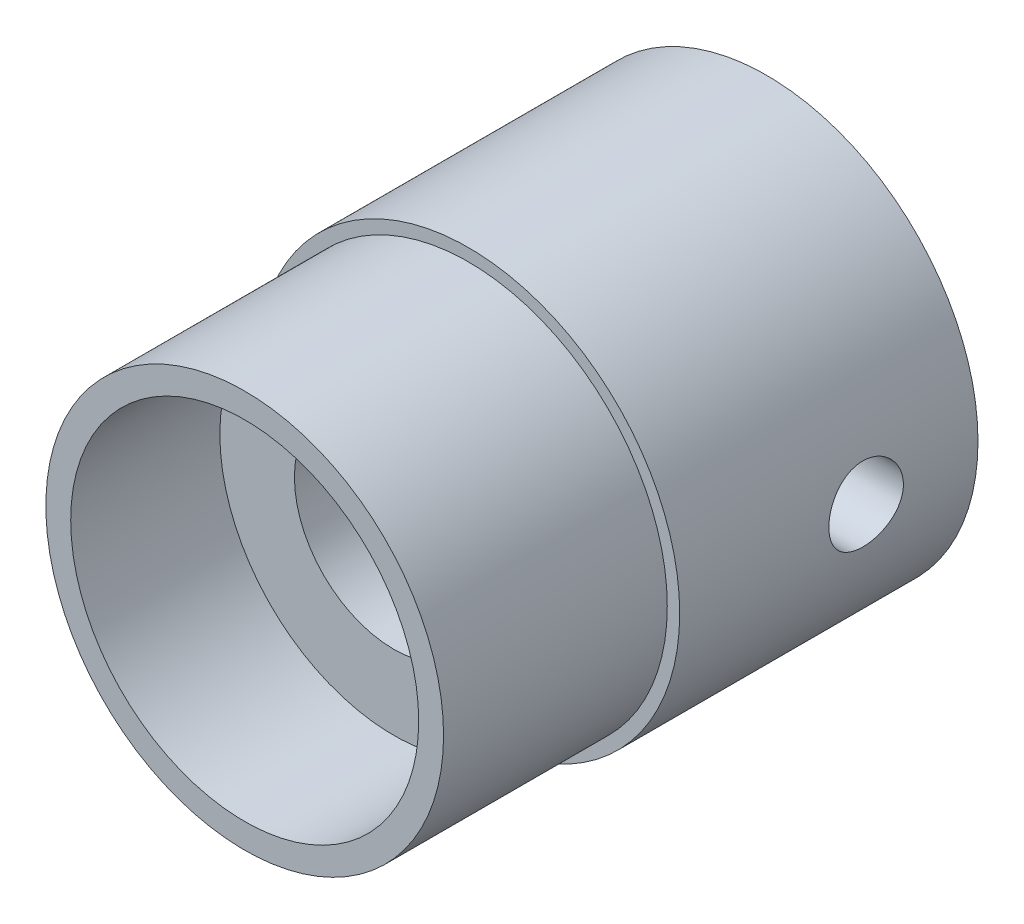
ISO-10303-21;
HEADER;
FILE_DESCRIPTION(('STEP AP214'),'2;1');
FILE_NAME('part.step','',(''),(''),'','','');
FILE_SCHEMA(('AUTOMOTIVE_DESIGN { 1 0 10303 214 1 1 1 1 }'));
ENDSEC;
DATA;
#1=APPLICATION_CONTEXT('core data for automotive mechanical design processes');
#2=APPLICATION_PROTOCOL_DEFINITION('international standard','automotive_design',2000,#1);
#3=PRODUCT_CONTEXT('',#1,'mechanical');
#4=PRODUCT('Part','Part','',(#3));
#5=PRODUCT_RELATED_PRODUCT_CATEGORY('part','',(#4));
#6=PRODUCT_DEFINITION_FORMATION('','',#4);
#7=PRODUCT_DEFINITION_CONTEXT('part definition',#1,'design');
#8=PRODUCT_DEFINITION('design','',#6,#7);
#9=PRODUCT_DEFINITION_SHAPE('','',#8);
#10=(LENGTH_UNIT() NAMED_UNIT(*) SI_UNIT(.MILLI.,.METRE.));
#11=(NAMED_UNIT(*) PLANE_ANGLE_UNIT() SI_UNIT($,.RADIAN.));
#12=(NAMED_UNIT(*) SI_UNIT($,.STERADIAN.) SOLID_ANGLE_UNIT());
#13=UNCERTAINTY_MEASURE_WITH_UNIT(LENGTH_MEASURE(1.E-05),#10,'distance_accuracy_value','');
#14=(GEOMETRIC_REPRESENTATION_CONTEXT(3) GLOBAL_UNCERTAINTY_ASSIGNED_CONTEXT((#13)) GLOBAL_UNIT_ASSIGNED_CONTEXT((#10,
#11,#12)) REPRESENTATION_CONTEXT('',''));
#15=CARTESIAN_POINT('',(0.,0.,0.));
#16=DIRECTION('',(0.,0.,1.));
#17=DIRECTION('',(1.,0.,0.));
#18=AXIS2_PLACEMENT_3D('',#15,#16,#17);
#19=CARTESIAN_POINT('',(0.,0.,3.));
#20=DIRECTION('',(0.,0.,1.));
#21=DIRECTION('',(1.,0.,0.));
#22=AXIS2_PLACEMENT_3D('',#19,#20,#21);
#23=PLANE('',#22);
#24=CARTESIAN_POINT('',(0.,0.,3.));
#25=DIRECTION('',(0.,0.,1.));
#26=DIRECTION('',(1.,0.,0.));
#27=AXIS2_PLACEMENT_3D('',#24,#25,#26);
#28=CIRCLE('',#27,4.);
#29=CARTESIAN_POINT('',(4.,0.,3.));
#30=VERTEX_POINT('',#29);
#31=EDGE_CURVE('E47',#30,#30,#28,.T.);
#32=ORIENTED_EDGE('',*,*,#31,.F.);
#33=EDGE_LOOP('',(#32));
#34=FACE_BOUND('',#33,.T.);
#35=CARTESIAN_POINT('',(0.,0.,3.));
#36=DIRECTION('',(0.,0.,1.));
#37=DIRECTION('',(1.,0.,0.));
#38=AXIS2_PLACEMENT_3D('',#35,#36,#37);
#39=CIRCLE('',#38,7.);
#40=CARTESIAN_POINT('',(7.,0.,3.));
#41=VERTEX_POINT('',#40);
#42=EDGE_CURVE('E39',#41,#41,#39,.T.);
#43=ORIENTED_EDGE('',*,*,#42,.T.);
#44=EDGE_LOOP('',(#43));
#45=FACE_BOUND('',#44,.T.);
#46=ADVANCED_FACE('F35',(#34,#45),#23,.T.);
#47=CARTESIAN_POINT('',(0.,0.,0.));
#48=DIRECTION('',(0.,0.,1.));
#49=DIRECTION('',(1.,0.,0.));
#50=AXIS2_PLACEMENT_3D('',#47,#48,#49);
#51=PLANE('',#50);
#52=CARTESIAN_POINT('',(0.,0.,0.));
#53=DIRECTION('',(0.,0.,1.));
#54=DIRECTION('',(1.,0.,0.));
#55=AXIS2_PLACEMENT_3D('',#52,#53,#54);
#56=CIRCLE('',#55,4.);
#57=CARTESIAN_POINT('',(4.,0.,0.));
#58=VERTEX_POINT('',#57);
#59=EDGE_CURVE('E220',#58,#58,#56,.T.);
#60=ORIENTED_EDGE('',*,*,#59,.T.);
#61=EDGE_LOOP('',(#60));
#62=FACE_BOUND('',#61,.T.);
#63=CARTESIAN_POINT('',(0.,0.,0.));
#64=DIRECTION('',(0.,0.,1.));
#65=DIRECTION('',(1.,0.,0.));
#66=AXIS2_PLACEMENT_3D('',#63,#64,#65);
#67=CIRCLE('',#66,5.5);
#68=CARTESIAN_POINT('',(5.5,0.,0.));
#69=VERTEX_POINT('',#68);
#70=EDGE_CURVE('E43',#69,#69,#67,.T.);
#71=ORIENTED_EDGE('',*,*,#70,.F.);
#72=EDGE_LOOP('',(#71));
#73=FACE_BOUND('',#72,.T.);
#74=ADVANCED_FACE('F37',(#62,#73),#51,.F.);
#75=CARTESIAN_POINT('',(0.,0.,3.));
#76=DIRECTION('',(0.,0.,-1.));
#77=DIRECTION('',(-1.,0.,0.));
#78=AXIS2_PLACEMENT_3D('',#75,#76,#77);
#79=CYLINDRICAL_SURFACE('',#78,4.);
#80=ORIENTED_EDGE('',*,*,#31,.T.);
#81=EDGE_LOOP('',(#80));
#82=FACE_BOUND('',#81,.T.);
#83=ORIENTED_EDGE('',*,*,#59,.F.);
#84=EDGE_LOOP('',(#83));
#85=FACE_BOUND('',#84,.T.);
#86=ADVANCED_FACE('F101',(#82,#85),#79,.F.);
#87=CARTESIAN_POINT('',(0.,0.,0.));
#88=DIRECTION('',(0.,0.,1.));
#89=DIRECTION('',(1.,0.,0.));
#90=AXIS2_PLACEMENT_3D('',#87,#88,#89);
#91=PLANE('',#90);
#92=CARTESIAN_POINT('',(0.,0.,0.));
#93=DIRECTION('',(0.,0.,1.));
#94=DIRECTION('',(1.,0.,0.));
#95=AXIS2_PLACEMENT_3D('',#92,#93,#94);
#96=CIRCLE('',#95,8.);
#97=CARTESIAN_POINT('',(8.,0.,0.));
#98=VERTEX_POINT('',#97);
#99=EDGE_CURVE('E10',#98,#98,#96,.T.);
#100=ORIENTED_EDGE('',*,*,#99,.F.);
#101=EDGE_LOOP('',(#100));
#102=FACE_BOUND('',#101,.T.);
#103=CARTESIAN_POINT('',(0.,0.,0.));
#104=DIRECTION('',(0.,0.,1.));
#105=DIRECTION('',(1.,0.,0.));
#106=AXIS2_PLACEMENT_3D('',#103,#104,#105);
#107=CIRCLE('',#106,8.5);
#108=CARTESIAN_POINT('',(8.5,0.,0.));
#109=VERTEX_POINT('',#108);
#110=EDGE_CURVE('E214',#109,#109,#107,.T.);
#111=ORIENTED_EDGE('',*,*,#110,.T.);
#112=EDGE_LOOP('',(#111));
#113=FACE_BOUND('',#112,.T.);
#114=ADVANCED_FACE('F99',(#102,#113),#91,.T.);
#115=CARTESIAN_POINT('',(0.,0.,-12.));
#116=DIRECTION('',(0.,0.,1.));
#117=DIRECTION('',(1.,0.,0.));
#118=AXIS2_PLACEMENT_3D('',#115,#116,#117);
#119=CYLINDRICAL_SURFACE('',#118,8.5);
#120=CARTESIAN_POINT('',(-8.5,0.,-9.00000000000001));
#121=CARTESIAN_POINT('',(-8.49999852465812,-0.0835602073116835,-8.9999967178691));
#122=CARTESIAN_POINT('',(-8.49875504437695,-0.167164170899166,-8.99299410009959));
#123=CARTESIAN_POINT('',(-8.49391434547826,-0.332022204672921,-8.96518320685825));
#124=CARTESIAN_POINT('',(-8.49031504366607,-0.413274128543538,-8.94436271235211));
#125=CARTESIAN_POINT('',(-8.4811659180518,-0.571019510053261,-8.88956848670669));
#126=CARTESIAN_POINT('',(-8.47561776634704,-0.647516980962108,-8.85560602873437));
#127=CARTESIAN_POINT('',(-8.4631790616307,-0.793719300559721,-8.77552262272468));
#128=CARTESIAN_POINT('',(-8.45628864154791,-0.863424820850617,-8.72940287849939));
#129=CARTESIAN_POINT('',(-8.44184556474541,-0.994816516549549,-8.62579132915275));
#130=CARTESIAN_POINT('',(-8.43428721228608,-1.05641975336287,-8.56819513097526));
#131=CARTESIAN_POINT('',(-8.41940313016037,-1.1691412650637,-8.44349027020934));
#132=CARTESIAN_POINT('',(-8.4120774161024,-1.22025883768728,-8.37638097100183));
#133=CARTESIAN_POINT('',(-8.39843282674879,-1.31089615224235,-8.23397760532877));
#134=CARTESIAN_POINT('',(-8.39212130489153,-1.35033279728854,-8.15862988281188));
#135=CARTESIAN_POINT('',(-8.38129933378097,-1.41595715270318,-8.0022490569533));
#136=CARTESIAN_POINT('',(-8.37678874764249,-1.44214587005801,-7.92121638626273));
#137=CARTESIAN_POINT('',(-8.37013636121934,-1.48026740658905,-7.75664894310292));
#138=CARTESIAN_POINT('',(-8.36797067223513,-1.49234409471487,-7.67314848174712));
#139=CARTESIAN_POINT('',(-8.36618114129228,-1.50234505486158,-7.50528048894824));
#140=CARTESIAN_POINT('',(-8.36655709762705,-1.50027044993802,-7.42091302684149));
#141=CARTESIAN_POINT('',(-8.36978659532625,-1.48214465879202,-7.25473986745596));
#142=CARTESIAN_POINT('',(-8.37261132730481,-1.46625598617926,-7.17291580162267));
#143=CARTESIAN_POINT('',(-8.38037493445764,-1.42120852873224,-7.01311326819002));
#144=CARTESIAN_POINT('',(-8.38531389010072,-1.39204923880641,-6.93513494708836));
#145=CARTESIAN_POINT('',(-8.39678011228507,-1.32112618145376,-6.78475593979735));
#146=CARTESIAN_POINT('',(-8.40331573888177,-1.27929578300233,-6.71238734241572));
#147=CARTESIAN_POINT('',(-8.41723322878403,-1.18426514162452,-6.575634979316));
#148=CARTESIAN_POINT('',(-8.42461516841691,-1.13106387280683,-6.5112519348913));
#149=CARTESIAN_POINT('',(-8.43951963661095,-1.01392044402847,-6.39135835341984));
#150=CARTESIAN_POINT('',(-8.44704269154381,-0.949839043227184,-6.33598383870425));
#151=CARTESIAN_POINT('',(-8.46128697681384,-0.813223017047743,-6.23675182224637));
#152=CARTESIAN_POINT('',(-8.46800820075587,-0.740688324257971,-6.19289441235744));
#153=CARTESIAN_POINT('',(-8.47990283414647,-0.589090433497641,-6.11792570133133));
#154=CARTESIAN_POINT('',(-8.48507466502145,-0.510020681297827,-6.08682738775337));
#155=CARTESIAN_POINT('',(-8.49327535201155,-0.347668482380529,-6.03839100335811));
#156=CARTESIAN_POINT('',(-8.49630440940878,-0.264386432134316,-6.02105164007075));
#157=CARTESIAN_POINT('',(-8.49985092576813,-0.0971451116191691,-6.00081200141636));
#158=CARTESIAN_POINT('',(-8.50040083433622,-0.0132090843615072,-5.99772516159403));
#159=CARTESIAN_POINT('',(-8.49901631664242,0.153980271251543,-6.00557941294352));
#160=CARTESIAN_POINT('',(-8.49708199798832,0.237233629020516,-6.01651989650209));
#161=CARTESIAN_POINT('',(-8.49096650695861,0.400111048540305,-6.05196307734012));
#162=CARTESIAN_POINT('',(-8.48680079660993,0.479756042957809,-6.07637247882884));
#163=CARTESIAN_POINT('',(-8.47668767054273,0.633823333081783,-6.13796046041181));
#164=CARTESIAN_POINT('',(-8.47074014495488,0.708245306379776,-6.17513982794151));
#165=CARTESIAN_POINT('',(-8.45764232694309,0.850557919353285,-6.2616330721365));
#166=CARTESIAN_POINT('',(-8.45048081539685,0.918377380876573,-6.31106232996766));
#167=CARTESIAN_POINT('',(-8.43578086254215,1.04482575376698,-6.42049471234006));
#168=CARTESIAN_POINT('',(-8.42824239034876,1.10345391044434,-6.48049870430486));
#169=CARTESIAN_POINT('',(-8.41353196779635,1.21055495751759,-6.61021768885172));
#170=CARTESIAN_POINT('',(-8.40636532837837,1.25890120329949,-6.68003794375939));
#171=CARTESIAN_POINT('',(-8.39331262284436,1.34317887649159,-6.82691843383291));
#172=CARTESIAN_POINT('',(-8.38742651273966,1.37911073038509,-6.90397842016974));
#173=CARTESIAN_POINT('',(-8.37764200573802,1.43735470236499,-7.06281171816086));
#174=CARTESIAN_POINT('',(-8.3737347552807,1.45972757437841,-7.14456218099255));
#175=CARTESIAN_POINT('',(-8.36832903130759,1.49040804698523,-7.31073623477485));
#176=CARTESIAN_POINT('',(-8.3668303202672,1.4987170345307,-7.39515956129642));
#177=CARTESIAN_POINT('',(-8.36642243845549,1.50099164151107,-7.5630165247977));
#178=CARTESIAN_POINT('',(-8.36747724556747,1.49515678461176,-7.64644743680323));
#179=CARTESIAN_POINT('',(-8.37197817944576,1.46974322873664,-7.81111994714207));
#180=CARTESIAN_POINT('',(-8.37542429563016,1.45016459057914,-7.89236155516174));
#181=CARTESIAN_POINT('',(-8.38430518558531,1.39789926667029,-8.05025834545232));
#182=CARTESIAN_POINT('',(-8.38973704421377,1.36523178909751,-8.12692006020943));
#183=CARTESIAN_POINT('',(-8.40197983656061,1.28773715228971,-8.27370686948198));
#184=CARTESIAN_POINT('',(-8.40879085209956,1.24290927156669,-8.34383157581884));
#185=CARTESIAN_POINT('',(-8.42313765215559,1.1416626166475,-8.47655797659853));
#186=CARTESIAN_POINT('',(-8.43068186379938,1.0850977566265,-8.53904734012171));
#187=CARTESIAN_POINT('',(-8.44557973306429,0.962289483399128,-8.65371472848376));
#188=CARTESIAN_POINT('',(-8.45293334643561,0.896043845959506,-8.70589037716825));
#189=CARTESIAN_POINT('',(-8.46668871310451,0.755134398648693,-8.79882734392791));
#190=CARTESIAN_POINT('',(-8.47308254914894,0.680408643630286,-8.83949593597092));
#191=CARTESIAN_POINT('',(-8.4841208835999,0.525100290133701,-8.90763861326231));
#192=CARTESIAN_POINT('',(-8.48876707834471,0.444523462097549,-8.93512550042317));
#193=CARTESIAN_POINT('',(-8.49480295232011,0.30305594054496,-8.97033309128865));
#194=CARTESIAN_POINT('',(-8.49674116179219,0.243008531002895,-8.98143982639593));
#195=CARTESIAN_POINT('',(-8.4993402109253,0.121981841577229,-8.99627440232578));
#196=CARTESIAN_POINT('',(-8.50000107706366,0.0610025810358466,-9.00000239609813));
#197=CARTESIAN_POINT('',(-8.5,0.,-9.00000000000001));
#198=B_SPLINE_CURVE_WITH_KNOTS('',3,(#120,#121,#122,#123,#124,#125,#126,#127,#128,#129,#130,
#131,#132,#133,#134,#135,#136,#137,#138,#139,#140,#141,#142,#143,#144,#145,#146,#147,#148,#149,
#150,#151,#152,#153,#154,#155,#156,#157,#158,#159,#160,#161,#162,#163,#164,#165,#166,#167,#168,
#169,#170,#171,#172,#173,#174,#175,#176,#177,#178,#179,#180,#181,#182,#183,#184,#185,#186,#187,
#188,#189,#190,#191,#192,#193,#194,#195,#196,#197),.UNSPECIFIED.,.T.,.F.,(4,2,2,2,2,2,2,2,2,2,2,
2,2,2,2,2,2,2,2,2,2,2,2,2,2,2,2,2,2,2,2,2,2,2,2,2,2,2,4),(0.,0.250457591265239,
0.501136955741326,0.751601762620913,1.0020417778349,1.25487340234721,1.50772195440904,
1.76232827341925,2.01691523667498,2.26888345171767,2.52083167063642,2.76985538403527,
3.01888857629236,3.26925473797253,3.51964349748054,3.77351864887561,4.02739582496182,
4.28153078678122,4.53564187317986,4.78641705372856,5.03718137196445,5.28623012591271,
5.53529423973253,5.78679991739405,6.03832623515671,6.29279109855224,6.54724721920709,
6.80055459873067,7.05383699613266,7.30356724592813,7.55329639063617,7.80266038647828,
8.05203918055448,8.30473127243324,8.55748151381617,8.81221395085162,9.066698491283,
9.24954720252123,9.43239212355178),.UNSPECIFIED.);
#199=CARTESIAN_POINT('',(-8.5,0.,-9.00000000000001));
#200=VERTEX_POINT('',#199);
#201=EDGE_CURVE('E86',#200,#200,#198,.T.);
#202=ORIENTED_EDGE('',*,*,#201,.F.);
#203=EDGE_LOOP('',(#202));
#204=FACE_BOUND('',#203,.T.);
#205=CARTESIAN_POINT('',(8.5,0.,-9.00000000000001));
#206=CARTESIAN_POINT('',(8.49999852465812,0.0835602073116835,-8.9999967178691));
#207=CARTESIAN_POINT('',(8.49875504437695,0.167164170899166,-8.99299410009959));
#208=CARTESIAN_POINT('',(8.49391434547826,0.332022204672921,-8.96518320685825));
#209=CARTESIAN_POINT('',(8.49031504366607,0.413274128543538,-8.94436271235211));
#210=CARTESIAN_POINT('',(8.4811659180518,0.571019510053261,-8.88956848670669));
#211=CARTESIAN_POINT('',(8.47561776634704,0.647516980962108,-8.85560602873437));
#212=CARTESIAN_POINT('',(8.4631790616307,0.793719300559721,-8.77552262272468));
#213=CARTESIAN_POINT('',(8.45628864154791,0.863424820850617,-8.72940287849939));
#214=CARTESIAN_POINT('',(8.44184556474541,0.994816516549549,-8.62579132915275));
#215=CARTESIAN_POINT('',(8.43428721228608,1.05641975336287,-8.56819513097526));
#216=CARTESIAN_POINT('',(8.41940313016037,1.1691412650637,-8.44349027020934));
#217=CARTESIAN_POINT('',(8.4120774161024,1.22025883768728,-8.37638097100183));
#218=CARTESIAN_POINT('',(8.39843282674879,1.31089615224235,-8.23397760532877));
#219=CARTESIAN_POINT('',(8.39212130489153,1.35033279728854,-8.15862988281188));
#220=CARTESIAN_POINT('',(8.38129933378097,1.41595715270318,-8.0022490569533));
#221=CARTESIAN_POINT('',(8.37678874764249,1.44214587005801,-7.92121638626273));
#222=CARTESIAN_POINT('',(8.37013636121934,1.48026740658905,-7.75664894310292));
#223=CARTESIAN_POINT('',(8.36797067223513,1.49234409471487,-7.67314848174712));
#224=CARTESIAN_POINT('',(8.36618114129228,1.50234505486158,-7.50528048894824));
#225=CARTESIAN_POINT('',(8.36655709762705,1.50027044993802,-7.42091302684149));
#226=CARTESIAN_POINT('',(8.36978659532625,1.48214465879202,-7.25473986745596));
#227=CARTESIAN_POINT('',(8.37261132730481,1.46625598617926,-7.17291580162267));
#228=CARTESIAN_POINT('',(8.38037493445764,1.42120852873224,-7.01311326819002));
#229=CARTESIAN_POINT('',(8.38531389010072,1.39204923880641,-6.93513494708836));
#230=CARTESIAN_POINT('',(8.39678011228507,1.32112618145376,-6.78475593979735));
#231=CARTESIAN_POINT('',(8.40331573888177,1.27929578300233,-6.71238734241572));
#232=CARTESIAN_POINT('',(8.41723322878403,1.18426514162452,-6.575634979316));
#233=CARTESIAN_POINT('',(8.42461516841691,1.13106387280683,-6.5112519348913));
#234=CARTESIAN_POINT('',(8.43951963661095,1.01392044402847,-6.39135835341984));
#235=CARTESIAN_POINT('',(8.44704269154381,0.949839043227184,-6.33598383870425));
#236=CARTESIAN_POINT('',(8.46128697681384,0.813223017047743,-6.23675182224637));
#237=CARTESIAN_POINT('',(8.46800820075587,0.740688324257971,-6.19289441235744));
#238=CARTESIAN_POINT('',(8.47990283414647,0.589090433497641,-6.11792570133133));
#239=CARTESIAN_POINT('',(8.48507466502145,0.510020681297827,-6.08682738775337));
#240=CARTESIAN_POINT('',(8.49327535201155,0.347668482380529,-6.03839100335811));
#241=CARTESIAN_POINT('',(8.49630440940878,0.264386432134316,-6.02105164007075));
#242=CARTESIAN_POINT('',(8.49985092576813,0.0971451116191691,-6.00081200141636));
#243=CARTESIAN_POINT('',(8.50040083433622,0.0132090843615072,-5.99772516159403));
#244=CARTESIAN_POINT('',(8.49901631664242,-0.153980271251543,-6.00557941294352));
#245=CARTESIAN_POINT('',(8.49708199798832,-0.237233629020516,-6.01651989650209));
#246=CARTESIAN_POINT('',(8.49096650695861,-0.400111048540305,-6.05196307734012));
#247=CARTESIAN_POINT('',(8.48680079660993,-0.479756042957809,-6.07637247882884));
#248=CARTESIAN_POINT('',(8.47668767054273,-0.633823333081783,-6.13796046041181));
#249=CARTESIAN_POINT('',(8.47074014495488,-0.708245306379776,-6.17513982794151));
#250=CARTESIAN_POINT('',(8.45764232694309,-0.850557919353285,-6.2616330721365));
#251=CARTESIAN_POINT('',(8.45048081539685,-0.918377380876573,-6.31106232996766));
#252=CARTESIAN_POINT('',(8.43578086254215,-1.04482575376698,-6.42049471234006));
#253=CARTESIAN_POINT('',(8.42824239034876,-1.10345391044434,-6.48049870430486));
#254=CARTESIAN_POINT('',(8.41353196779635,-1.21055495751759,-6.61021768885172));
#255=CARTESIAN_POINT('',(8.40636532837837,-1.25890120329949,-6.68003794375939));
#256=CARTESIAN_POINT('',(8.39331262284436,-1.34317887649159,-6.82691843383291));
#257=CARTESIAN_POINT('',(8.38742651273966,-1.37911073038509,-6.90397842016974));
#258=CARTESIAN_POINT('',(8.37764200573802,-1.43735470236499,-7.06281171816086));
#259=CARTESIAN_POINT('',(8.3737347552807,-1.45972757437841,-7.14456218099255));
#260=CARTESIAN_POINT('',(8.36832903130759,-1.49040804698523,-7.31073623477485));
#261=CARTESIAN_POINT('',(8.3668303202672,-1.4987170345307,-7.39515956129642));
#262=CARTESIAN_POINT('',(8.36642243845549,-1.50099164151107,-7.5630165247977));
#263=CARTESIAN_POINT('',(8.36747724556747,-1.49515678461176,-7.64644743680323));
#264=CARTESIAN_POINT('',(8.37197817944576,-1.46974322873664,-7.81111994714207));
#265=CARTESIAN_POINT('',(8.37542429563016,-1.45016459057914,-7.89236155516174));
#266=CARTESIAN_POINT('',(8.38430518558531,-1.39789926667029,-8.05025834545232));
#267=CARTESIAN_POINT('',(8.38973704421377,-1.36523178909751,-8.12692006020943));
#268=CARTESIAN_POINT('',(8.40197983656061,-1.28773715228971,-8.27370686948198));
#269=CARTESIAN_POINT('',(8.40879085209956,-1.24290927156669,-8.34383157581884));
#270=CARTESIAN_POINT('',(8.42313765215559,-1.1416626166475,-8.47655797659853));
#271=CARTESIAN_POINT('',(8.43068186379938,-1.0850977566265,-8.53904734012171));
#272=CARTESIAN_POINT('',(8.44557973306429,-0.962289483399128,-8.65371472848376));
#273=CARTESIAN_POINT('',(8.45293334643561,-0.896043845959506,-8.70589037716825));
#274=CARTESIAN_POINT('',(8.46668871310451,-0.755134398648693,-8.79882734392791));
#275=CARTESIAN_POINT('',(8.47308254914894,-0.680408643630286,-8.83949593597092));
#276=CARTESIAN_POINT('',(8.4841208835999,-0.525100290133701,-8.90763861326231));
#277=CARTESIAN_POINT('',(8.48876707834471,-0.444523462097549,-8.93512550042317));
#278=CARTESIAN_POINT('',(8.49480295232011,-0.30305594054496,-8.97033309128865));
#279=CARTESIAN_POINT('',(8.49674116179219,-0.243008531002895,-8.98143982639593));
#280=CARTESIAN_POINT('',(8.4993402109253,-0.121981841577229,-8.99627440232578));
#281=CARTESIAN_POINT('',(8.50000107706366,-0.0610025810358466,-9.00000239609813));
#282=CARTESIAN_POINT('',(8.5,0.,-9.00000000000001));
#283=B_SPLINE_CURVE_WITH_KNOTS('',3,(#205,#206,#207,#208,#209,#210,#211,#212,#213,#214,#215,
#216,#217,#218,#219,#220,#221,#222,#223,#224,#225,#226,#227,#228,#229,#230,#231,#232,#233,#234,
#235,#236,#237,#238,#239,#240,#241,#242,#243,#244,#245,#246,#247,#248,#249,#250,#251,#252,#253,
#254,#255,#256,#257,#258,#259,#260,#261,#262,#263,#264,#265,#266,#267,#268,#269,#270,#271,#272,
#273,#274,#275,#276,#277,#278,#279,#280,#281,#282),.UNSPECIFIED.,.T.,.F.,(4,2,2,2,2,2,2,2,2,2,2,
2,2,2,2,2,2,2,2,2,2,2,2,2,2,2,2,2,2,2,2,2,2,2,2,2,2,2,4),(0.,0.250457591265239,
0.501136955741326,0.751601762620913,1.0020417778349,1.25487340234721,1.50772195440904,
1.76232827341925,2.01691523667498,2.26888345171767,2.52083167063642,2.76985538403527,
3.01888857629236,3.26925473797253,3.51964349748054,3.77351864887561,4.02739582496182,
4.28153078678122,4.53564187317986,4.78641705372856,5.03718137196445,5.28623012591271,
5.53529423973253,5.78679991739405,6.03832623515671,6.29279109855224,6.54724721920709,
6.80055459873067,7.05383699613266,7.30356724592813,7.55329639063617,7.80266038647828,
8.05203918055448,8.30473127243324,8.55748151381617,8.81221395085162,9.066698491283,
9.24954720252123,9.43239212355178),.UNSPECIFIED.);
#284=CARTESIAN_POINT('',(8.5,0.,-9.00000000000001));
#285=VERTEX_POINT('',#284);
#286=EDGE_CURVE('E58',#285,#285,#283,.T.);
#287=ORIENTED_EDGE('',*,*,#286,.F.);
#288=EDGE_LOOP('',(#287));
#289=FACE_BOUND('',#288,.T.);
#290=CARTESIAN_POINT('',(0.,0.,-12.));
#291=DIRECTION('',(0.,0.,1.));
#292=DIRECTION('',(1.,0.,0.));
#293=AXIS2_PLACEMENT_3D('',#290,#291,#292);
#294=CIRCLE('',#293,8.5);
#295=CARTESIAN_POINT('',(8.5,0.,-12.));
#296=VERTEX_POINT('',#295);
#297=EDGE_CURVE('E216',#296,#296,#294,.T.);
#298=ORIENTED_EDGE('',*,*,#297,.T.);
#299=EDGE_LOOP('',(#298));
#300=FACE_BOUND('',#299,.T.);
#301=ORIENTED_EDGE('',*,*,#110,.F.);
#302=EDGE_LOOP('',(#301));
#303=FACE_BOUND('',#302,.T.);
#304=ADVANCED_FACE('F93',(#204,#289,#300,#303),#119,.T.);
#305=CARTESIAN_POINT('',(0.,0.,-12.));
#306=DIRECTION('',(0.,0.,1.));
#307=DIRECTION('',(1.,0.,0.));
#308=AXIS2_PLACEMENT_3D('',#305,#306,#307);
#309=PLANE('',#308);
#310=CARTESIAN_POINT('',(0.,0.,-12.));
#311=DIRECTION('',(0.,0.,1.));
#312=DIRECTION('',(1.,0.,0.));
#313=AXIS2_PLACEMENT_3D('',#310,#311,#312);
#314=CIRCLE('',#313,5.5);
#315=CARTESIAN_POINT('',(5.5,0.,-12.));
#316=VERTEX_POINT('',#315);
#317=EDGE_CURVE('E217',#316,#316,#314,.T.);
#318=ORIENTED_EDGE('',*,*,#317,.T.);
#319=EDGE_LOOP('',(#318));
#320=FACE_BOUND('',#319,.T.);
#321=ORIENTED_EDGE('',*,*,#297,.F.);
#322=EDGE_LOOP('',(#321));
#323=FACE_BOUND('',#322,.T.);
#324=ADVANCED_FACE('F98',(#320,#323),#309,.F.);
#325=CARTESIAN_POINT('',(0.,0.,-12.));
#326=DIRECTION('',(0.,0.,1.));
#327=DIRECTION('',(1.,0.,0.));
#328=AXIS2_PLACEMENT_3D('',#325,#326,#327);
#329=CYLINDRICAL_SURFACE('',#328,5.5);
#330=CARTESIAN_POINT('',(5.5,0.,-9.00000000000001));
#331=CARTESIAN_POINT('',(5.49999882717412,0.0826209133321935,-8.99999818738898));
#332=CARTESIAN_POINT('',(5.49812007260761,0.165260978812708,-8.99315093641659));
#333=CARTESIAN_POINT('',(5.49080798085451,0.328155930157698,-8.96599416969682));
#334=CARTESIAN_POINT('',(5.48537304740499,0.408409727977265,-8.94567860837141));
#335=CARTESIAN_POINT('',(5.47154772174135,0.564157626055395,-8.89229826826158));
#336=CARTESIAN_POINT('',(5.46316123869395,0.639657866970163,-8.85925034733809));
#337=CARTESIAN_POINT('',(5.44431654412848,0.78404449615972,-8.78140706733758));
#338=CARTESIAN_POINT('',(5.43385816956517,0.852930363289777,-8.73661078364608));
#339=CARTESIAN_POINT('',(5.41171397042059,0.983796947573261,-8.63540016353274));
#340=CARTESIAN_POINT('',(5.4000064149043,1.04559512916994,-8.5787545591458));
#341=CARTESIAN_POINT('',(5.37682112935063,1.15894293682478,-8.4559473639701));
#342=CARTESIAN_POINT('',(5.36534343055203,1.21049117824722,-8.38978448959769));
#343=CARTESIAN_POINT('',(5.34369384163659,1.30277794539498,-8.24834875242053));
#344=CARTESIAN_POINT('',(5.33354930058623,1.34330426837587,-8.17293285506372));
#345=CARTESIAN_POINT('',(5.31603507411917,1.41102916361228,-8.01603617180063));
#346=CARTESIAN_POINT('',(5.30866485085754,1.43823031946844,-7.93455656511151));
#347=CARTESIAN_POINT('',(5.2977584719274,1.47789456441268,-7.76987210498753));
#348=CARTESIAN_POINT('',(5.29413612283787,1.49068960543229,-7.68675305183808));
#349=CARTESIAN_POINT('',(5.29087829084083,1.50221364409134,-7.51947531699119));
#350=CARTESIAN_POINT('',(5.2912420257326,1.50094540140883,-7.43531684249998));
#351=CARTESIAN_POINT('',(5.29583824875456,1.48464191780301,-7.27095844903373));
#352=CARTESIAN_POINT('',(5.29995718313671,1.47001073668932,-7.19071476539777));
#353=CARTESIAN_POINT('',(5.31141755794059,1.42804483871807,-7.03386671397719));
#354=CARTESIAN_POINT('',(5.31875926644153,1.40070906504648,-6.95726264953371));
#355=CARTESIAN_POINT('',(5.33593618292326,1.33378629826471,-6.80882647945255));
#356=CARTESIAN_POINT('',(5.34579959764141,1.29405951882948,-6.73706079896638));
#357=CARTESIAN_POINT('',(5.36689368797792,1.20357988022174,-6.60107355259034));
#358=CARTESIAN_POINT('',(5.37812464363249,1.15282476106209,-6.53685353716126));
#359=CARTESIAN_POINT('',(5.40115894990605,1.03967346682896,-6.41547481019357));
#360=CARTESIAN_POINT('',(5.41296874297114,0.976938646167253,-6.35863255071106));
#361=CARTESIAN_POINT('',(5.43548647707978,0.842682011788639,-6.25620903502221));
#362=CARTESIAN_POINT('',(5.44619437064292,0.771159819718557,-6.21062826395038));
#363=CARTESIAN_POINT('',(5.46537278121261,0.620853953739627,-6.13187332722508));
#364=CARTESIAN_POINT('',(5.47383251287305,0.542037637417776,-6.09875866141605));
#365=CARTESIAN_POINT('',(5.48748356142612,0.379672688714393,-6.04634202748586));
#366=CARTESIAN_POINT('',(5.49267562644564,0.296125144317684,-6.02703689755586));
#367=CARTESIAN_POINT('',(5.49909228776313,0.129368170483252,-6.00328938220303));
#368=CARTESIAN_POINT('',(5.50043163125371,0.0462242977839816,-5.99841700467964));
#369=CARTESIAN_POINT('',(5.49932301585136,-0.119693365637971,-6.00248274751343));
#370=CARTESIAN_POINT('',(5.49687546782998,-0.202467195532506,-6.01141936961649));
#371=CARTESIAN_POINT('',(5.48854239265957,-0.363745097739555,-6.04249750270314));
#372=CARTESIAN_POINT('',(5.48271986472129,-0.442299324272676,-6.06439719275701));
#373=CARTESIAN_POINT('',(5.46829923535645,-0.59460986744863,-6.12049724464049));
#374=CARTESIAN_POINT('',(5.45970082634473,-0.668365651304996,-6.15469896966128));
#375=CARTESIAN_POINT('',(5.44041573828275,-0.81064116119459,-6.23521644228568));
#376=CARTESIAN_POINT('',(5.4296902954988,-0.879024602412583,-6.28176348726155));
#377=CARTESIAN_POINT('',(5.40738988410034,-1.00716022013082,-6.38536128754524));
#378=CARTESIAN_POINT('',(5.39581474001048,-1.06691060617763,-6.44241421615751));
#379=CARTESIAN_POINT('',(5.37269401558495,-1.17791060344313,-6.56741403803488));
#380=CARTESIAN_POINT('',(5.36115944983886,-1.22885627747222,-6.63563338227895));
#381=CARTESIAN_POINT('',(5.33980026187814,-1.3185858220796,-6.77989864721925));
#382=CARTESIAN_POINT('',(5.32997557125461,-1.35737017925924,-6.85594425460752));
#383=CARTESIAN_POINT('',(5.31326248703816,-1.4213855831721,-7.01334062824197));
#384=CARTESIAN_POINT('',(5.30635748202252,-1.44669352306986,-7.09465826052523));
#385=CARTESIAN_POINT('',(5.29626814696188,-1.48320917220692,-7.26061683802756));
#386=CARTESIAN_POINT('',(5.29308281231875,-1.49442068863148,-7.34525687955367));
#387=CARTESIAN_POINT('',(5.29088009671763,-1.50219895576908,-7.51233840381745));
#388=CARTESIAN_POINT('',(5.29172336001588,-1.49925533217026,-7.59475558872249));
#389=CARTESIAN_POINT('',(5.29715501736986,-1.47994837643976,-7.75787064773497));
#390=CARTESIAN_POINT('',(5.30174330649891,-1.46358542028567,-7.83856856994704));
#391=CARTESIAN_POINT('',(5.31406316491799,-1.41819408435119,-7.99530631577613));
#392=CARTESIAN_POINT('',(5.32176783125817,-1.38927395449127,-8.07137975324176));
#393=CARTESIAN_POINT('',(5.33945189987963,-1.31967304541386,-8.21765327681334));
#394=CARTESIAN_POINT('',(5.34943167369227,-1.27899034504456,-8.28785240106517));
#395=CARTESIAN_POINT('',(5.37092379381814,-1.18555430984852,-8.42271059769265));
#396=CARTESIAN_POINT('',(5.38247375845259,-1.13246901822125,-8.48713370484311));
#397=CARTESIAN_POINT('',(5.40559990490855,-1.01636011199274,-8.60631640679461));
#398=CARTESIAN_POINT('',(5.41717609247304,-0.953334059387997,-8.66107362400533));
#399=CARTESIAN_POINT('',(5.43936459177359,-0.817407725686081,-8.76059461451941));
#400=CARTESIAN_POINT('',(5.44994907753807,-0.744315866262522,-8.80510348086698));
#401=CARTESIAN_POINT('',(5.46865263780403,-0.591399899839281,-8.88113243621148));
#402=CARTESIAN_POINT('',(5.47677322151197,-0.511579952421223,-8.91266048055433));
#403=CARTESIAN_POINT('',(5.48864193995757,-0.360100101218213,-8.957939509979));
#404=CARTESIAN_POINT('',(5.49286947681091,-0.289064640262469,-8.97367455124171));
#405=CARTESIAN_POINT('',(5.49854887164354,-0.145357607941485,-8.99470502531883));
#406=CARTESIAN_POINT('',(5.5000010318002,-0.0726862155649472,-9.0000015946548));
#407=CARTESIAN_POINT('',(5.5,0.,-9.00000000000001));
#408=B_SPLINE_CURVE_WITH_KNOTS('',3,(#330,#331,#332,#333,#334,#335,#336,#337,#338,#339,#340,
#341,#342,#343,#344,#345,#346,#347,#348,#349,#350,#351,#352,#353,#354,#355,#356,#357,#358,#359,
#360,#361,#362,#363,#364,#365,#366,#367,#368,#369,#370,#371,#372,#373,#374,#375,#376,#377,#378,
#379,#380,#381,#382,#383,#384,#385,#386,#387,#388,#389,#390,#391,#392,#393,#394,#395,#396,#397,
#398,#399,#400,#401,#402,#403,#404,#405,#406,#407),.UNSPECIFIED.,.T.,.F.,(4,2,2,2,2,2,2,2,2,2,2,
2,2,2,2,2,2,2,2,2,2,2,2,2,2,2,2,2,2,2,2,2,2,2,2,2,2,2,4),(0.,0.247596106854897,0.4953034285513,
0.742683902420579,0.990083851364706,1.24285878223179,1.49566783659324,1.7530459365022,
2.01037411390997,2.26164304860926,2.51286267696538,2.75672886674887,3.00061534583717,
3.24735926767928,3.49415380139122,3.74938528550775,4.00462776284424,4.26107349736029,
4.51746049766945,4.76612811343083,5.01476875105251,5.25891111200196,5.50308053475837,
5.75219469009682,6.00136043656004,6.25790073064871,6.51443075867913,6.76948096455405,
7.02446227124212,7.2706885222863,7.51690787489589,7.76104555655819,8.00522313517588,
8.25689011392093,8.50861891104975,8.7660587228906,9.02334052607438,9.24118832093192,
9.45901239561307),.UNSPECIFIED.);
#409=CARTESIAN_POINT('',(5.5,0.,-9.00000000000001));
#410=VERTEX_POINT('',#409);
#411=EDGE_CURVE('E50',#410,#410,#408,.T.);
#412=ORIENTED_EDGE('',*,*,#411,.T.);
#413=EDGE_LOOP('',(#412));
#414=FACE_BOUND('',#413,.T.);
#415=CARTESIAN_POINT('',(-5.5,0.,-9.00000000000001));
#416=CARTESIAN_POINT('',(-5.49999882717412,-0.0826209133321935,-8.99999818738898));
#417=CARTESIAN_POINT('',(-5.49812007260761,-0.165260978812708,-8.99315093641659));
#418=CARTESIAN_POINT('',(-5.49080798085451,-0.328155930157698,-8.96599416969682));
#419=CARTESIAN_POINT('',(-5.48537304740499,-0.408409727977265,-8.94567860837141));
#420=CARTESIAN_POINT('',(-5.47154772174135,-0.564157626055395,-8.89229826826158));
#421=CARTESIAN_POINT('',(-5.46316123869395,-0.639657866970163,-8.85925034733809));
#422=CARTESIAN_POINT('',(-5.44431654412848,-0.78404449615972,-8.78140706733758));
#423=CARTESIAN_POINT('',(-5.43385816956517,-0.852930363289777,-8.73661078364608));
#424=CARTESIAN_POINT('',(-5.41171397042059,-0.983796947573261,-8.63540016353274));
#425=CARTESIAN_POINT('',(-5.4000064149043,-1.04559512916994,-8.5787545591458));
#426=CARTESIAN_POINT('',(-5.37682112935063,-1.15894293682478,-8.4559473639701));
#427=CARTESIAN_POINT('',(-5.36534343055203,-1.21049117824722,-8.38978448959769));
#428=CARTESIAN_POINT('',(-5.34369384163659,-1.30277794539498,-8.24834875242053));
#429=CARTESIAN_POINT('',(-5.33354930058623,-1.34330426837587,-8.17293285506372));
#430=CARTESIAN_POINT('',(-5.31603507411917,-1.41102916361228,-8.01603617180063));
#431=CARTESIAN_POINT('',(-5.30866485085754,-1.43823031946844,-7.93455656511151));
#432=CARTESIAN_POINT('',(-5.2977584719274,-1.47789456441268,-7.76987210498753));
#433=CARTESIAN_POINT('',(-5.29413612283787,-1.49068960543229,-7.68675305183808));
#434=CARTESIAN_POINT('',(-5.29087829084083,-1.50221364409134,-7.51947531699119));
#435=CARTESIAN_POINT('',(-5.2912420257326,-1.50094540140883,-7.43531684249998));
#436=CARTESIAN_POINT('',(-5.29583824875456,-1.48464191780301,-7.27095844903373));
#437=CARTESIAN_POINT('',(-5.29995718313671,-1.47001073668932,-7.19071476539777));
#438=CARTESIAN_POINT('',(-5.31141755794059,-1.42804483871807,-7.03386671397719));
#439=CARTESIAN_POINT('',(-5.31875926644153,-1.40070906504648,-6.95726264953371));
#440=CARTESIAN_POINT('',(-5.33593618292326,-1.33378629826471,-6.80882647945255));
#441=CARTESIAN_POINT('',(-5.34579959764141,-1.29405951882948,-6.73706079896638));
#442=CARTESIAN_POINT('',(-5.36689368797792,-1.20357988022174,-6.60107355259034));
#443=CARTESIAN_POINT('',(-5.37812464363249,-1.15282476106209,-6.53685353716126));
#444=CARTESIAN_POINT('',(-5.40115894990605,-1.03967346682896,-6.41547481019357));
#445=CARTESIAN_POINT('',(-5.41296874297114,-0.976938646167253,-6.35863255071106));
#446=CARTESIAN_POINT('',(-5.43548647707978,-0.842682011788639,-6.25620903502221));
#447=CARTESIAN_POINT('',(-5.44619437064292,-0.771159819718557,-6.21062826395038));
#448=CARTESIAN_POINT('',(-5.46537278121261,-0.620853953739627,-6.13187332722508));
#449=CARTESIAN_POINT('',(-5.47383251287305,-0.542037637417776,-6.09875866141605));
#450=CARTESIAN_POINT('',(-5.48748356142612,-0.379672688714393,-6.04634202748586));
#451=CARTESIAN_POINT('',(-5.49267562644564,-0.296125144317684,-6.02703689755586));
#452=CARTESIAN_POINT('',(-5.49909228776313,-0.129368170483252,-6.00328938220303));
#453=CARTESIAN_POINT('',(-5.50043163125371,-0.0462242977839816,-5.99841700467964));
#454=CARTESIAN_POINT('',(-5.49932301585136,0.119693365637971,-6.00248274751343));
#455=CARTESIAN_POINT('',(-5.49687546782998,0.202467195532506,-6.01141936961649));
#456=CARTESIAN_POINT('',(-5.48854239265957,0.363745097739555,-6.04249750270314));
#457=CARTESIAN_POINT('',(-5.48271986472129,0.442299324272676,-6.06439719275701));
#458=CARTESIAN_POINT('',(-5.46829923535645,0.59460986744863,-6.12049724464049));
#459=CARTESIAN_POINT('',(-5.45970082634473,0.668365651304996,-6.15469896966128));
#460=CARTESIAN_POINT('',(-5.44041573828275,0.81064116119459,-6.23521644228568));
#461=CARTESIAN_POINT('',(-5.4296902954988,0.879024602412583,-6.28176348726155));
#462=CARTESIAN_POINT('',(-5.40738988410034,1.00716022013082,-6.38536128754524));
#463=CARTESIAN_POINT('',(-5.39581474001048,1.06691060617763,-6.44241421615751));
#464=CARTESIAN_POINT('',(-5.37269401558495,1.17791060344313,-6.56741403803488));
#465=CARTESIAN_POINT('',(-5.36115944983886,1.22885627747222,-6.63563338227895));
#466=CARTESIAN_POINT('',(-5.33980026187814,1.3185858220796,-6.77989864721925));
#467=CARTESIAN_POINT('',(-5.32997557125461,1.35737017925924,-6.85594425460752));
#468=CARTESIAN_POINT('',(-5.31326248703816,1.4213855831721,-7.01334062824197));
#469=CARTESIAN_POINT('',(-5.30635748202252,1.44669352306986,-7.09465826052523));
#470=CARTESIAN_POINT('',(-5.29626814696188,1.48320917220692,-7.26061683802756));
#471=CARTESIAN_POINT('',(-5.29308281231875,1.49442068863148,-7.34525687955367));
#472=CARTESIAN_POINT('',(-5.29088009671763,1.50219895576908,-7.51233840381745));
#473=CARTESIAN_POINT('',(-5.29172336001588,1.49925533217026,-7.59475558872249));
#474=CARTESIAN_POINT('',(-5.29715501736986,1.47994837643976,-7.75787064773497));
#475=CARTESIAN_POINT('',(-5.30174330649891,1.46358542028567,-7.83856856994704));
#476=CARTESIAN_POINT('',(-5.31406316491799,1.41819408435119,-7.99530631577613));
#477=CARTESIAN_POINT('',(-5.32176783125817,1.38927395449127,-8.07137975324176));
#478=CARTESIAN_POINT('',(-5.33945189987963,1.31967304541386,-8.21765327681334));
#479=CARTESIAN_POINT('',(-5.34943167369227,1.27899034504456,-8.28785240106517));
#480=CARTESIAN_POINT('',(-5.37092379381814,1.18555430984852,-8.42271059769265));
#481=CARTESIAN_POINT('',(-5.38247375845259,1.13246901822125,-8.48713370484311));
#482=CARTESIAN_POINT('',(-5.40559990490855,1.01636011199274,-8.60631640679461));
#483=CARTESIAN_POINT('',(-5.41717609247304,0.953334059387997,-8.66107362400533));
#484=CARTESIAN_POINT('',(-5.43936459177359,0.817407725686081,-8.76059461451941));
#485=CARTESIAN_POINT('',(-5.44994907753807,0.744315866262522,-8.80510348086698));
#486=CARTESIAN_POINT('',(-5.46865263780403,0.591399899839281,-8.88113243621148));
#487=CARTESIAN_POINT('',(-5.47677322151197,0.511579952421223,-8.91266048055433));
#488=CARTESIAN_POINT('',(-5.48864193995757,0.360100101218213,-8.957939509979));
#489=CARTESIAN_POINT('',(-5.49286947681091,0.289064640262469,-8.97367455124171));
#490=CARTESIAN_POINT('',(-5.49854887164354,0.145357607941485,-8.99470502531883));
#491=CARTESIAN_POINT('',(-5.5000010318002,0.0726862155649472,-9.0000015946548));
#492=CARTESIAN_POINT('',(-5.5,0.,-9.00000000000001));
#493=B_SPLINE_CURVE_WITH_KNOTS('',3,(#415,#416,#417,#418,#419,#420,#421,#422,#423,#424,#425,
#426,#427,#428,#429,#430,#431,#432,#433,#434,#435,#436,#437,#438,#439,#440,#441,#442,#443,#444,
#445,#446,#447,#448,#449,#450,#451,#452,#453,#454,#455,#456,#457,#458,#459,#460,#461,#462,#463,
#464,#465,#466,#467,#468,#469,#470,#471,#472,#473,#474,#475,#476,#477,#478,#479,#480,#481,#482,
#483,#484,#485,#486,#487,#488,#489,#490,#491,#492),.UNSPECIFIED.,.T.,.F.,(4,2,2,2,2,2,2,2,2,2,2,
2,2,2,2,2,2,2,2,2,2,2,2,2,2,2,2,2,2,2,2,2,2,2,2,2,2,2,4),(0.,0.247596106854897,0.4953034285513,
0.742683902420579,0.990083851364706,1.24285878223179,1.49566783659324,1.7530459365022,
2.01037411390997,2.26164304860926,2.51286267696538,2.75672886674887,3.00061534583717,
3.24735926767928,3.49415380139122,3.74938528550775,4.00462776284424,4.26107349736029,
4.51746049766945,4.76612811343083,5.01476875105251,5.25891111200196,5.50308053475837,
5.75219469009682,6.00136043656004,6.25790073064871,6.51443075867913,6.76948096455405,
7.02446227124212,7.2706885222863,7.51690787489589,7.76104555655819,8.00522313517588,
8.25689011392093,8.50861891104975,8.7660587228906,9.02334052607438,9.24118832093192,
9.45901239561307),.UNSPECIFIED.);
#494=CARTESIAN_POINT('',(-5.5,0.,-9.00000000000001));
#495=VERTEX_POINT('',#494);
#496=EDGE_CURVE('E59',#495,#495,#493,.T.);
#497=ORIENTED_EDGE('',*,*,#496,.T.);
#498=EDGE_LOOP('',(#497));
#499=FACE_BOUND('',#498,.T.);
#500=ORIENTED_EDGE('',*,*,#317,.F.);
#501=EDGE_LOOP('',(#500));
#502=FACE_BOUND('',#501,.T.);
#503=ORIENTED_EDGE('',*,*,#70,.T.);
#504=EDGE_LOOP('',(#503));
#505=FACE_BOUND('',#504,.T.);
#506=ADVANCED_FACE('F64',(#414,#499,#502,#505),#329,.F.);
#507=CARTESIAN_POINT('',(-8.5,0.,-7.5));
#508=DIRECTION('',(1.,0.,0.));
#509=DIRECTION('',(0.,0.,-1.));
#510=AXIS2_PLACEMENT_3D('',#507,#508,#509);
#511=CYLINDRICAL_SURFACE('',#510,1.5);
#512=ORIENTED_EDGE('',*,*,#201,.T.);
#513=EDGE_LOOP('',(#512));
#514=FACE_BOUND('',#513,.T.);
#515=ORIENTED_EDGE('',*,*,#496,.F.);
#516=EDGE_LOOP('',(#515));
#517=FACE_BOUND('',#516,.T.);
#518=ADVANCED_FACE('F72',(#514,#517),#511,.F.);
#519=ORIENTED_EDGE('',*,*,#286,.T.);
#520=EDGE_LOOP('',(#519));
#521=FACE_BOUND('',#520,.T.);
#522=ORIENTED_EDGE('',*,*,#411,.F.);
#523=EDGE_LOOP('',(#522));
#524=FACE_BOUND('',#523,.T.);
#525=ADVANCED_FACE('F67',(#521,#524),#511,.F.);
#526=CARTESIAN_POINT('',(0.,0.,0.));
#527=DIRECTION('',(0.,0.,1.));
#528=DIRECTION('',(1.,0.,0.));
#529=AXIS2_PLACEMENT_3D('',#526,#527,#528);
#530=CYLINDRICAL_SURFACE('',#529,8.);
#531=ORIENTED_EDGE('',*,*,#99,.T.);
#532=EDGE_LOOP('',(#531));
#533=FACE_BOUND('',#532,.T.);
#534=CARTESIAN_POINT('',(0.,0.,9.));
#535=DIRECTION('',(0.,0.,1.));
#536=DIRECTION('',(1.,0.,0.));
#537=AXIS2_PLACEMENT_3D('',#534,#535,#536);
#538=CIRCLE('',#537,8.);
#539=CARTESIAN_POINT('',(8.,0.,9.));
#540=VERTEX_POINT('',#539);
#541=EDGE_CURVE('E87',#540,#540,#538,.T.);
#542=ORIENTED_EDGE('',*,*,#541,.F.);
#543=EDGE_LOOP('',(#542));
#544=FACE_BOUND('',#543,.T.);
#545=ADVANCED_FACE('F71',(#533,#544),#530,.T.);
#546=CARTESIAN_POINT('',(0.,0.,0.));
#547=DIRECTION('',(0.,0.,1.));
#548=DIRECTION('',(1.,0.,0.));
#549=AXIS2_PLACEMENT_3D('',#546,#547,#548);
#550=CYLINDRICAL_SURFACE('',#549,7.);
#551=ORIENTED_EDGE('',*,*,#42,.F.);
#552=EDGE_LOOP('',(#551));
#553=FACE_BOUND('',#552,.T.);
#554=CARTESIAN_POINT('',(0.,0.,9.));
#555=DIRECTION('',(0.,0.,1.));
#556=DIRECTION('',(1.,0.,0.));
#557=AXIS2_PLACEMENT_3D('',#554,#555,#556);
#558=CIRCLE('',#557,7.);
#559=CARTESIAN_POINT('',(7.,0.,9.));
#560=VERTEX_POINT('',#559);
#561=EDGE_CURVE('E119',#560,#560,#558,.T.);
#562=ORIENTED_EDGE('',*,*,#561,.T.);
#563=EDGE_LOOP('',(#562));
#564=FACE_BOUND('',#563,.T.);
#565=ADVANCED_FACE('F125',(#553,#564),#550,.F.);
#566=CARTESIAN_POINT('',(0.,0.,9.));
#567=DIRECTION('',(0.,0.,1.));
#568=DIRECTION('',(1.,0.,0.));
#569=AXIS2_PLACEMENT_3D('',#566,#567,#568);
#570=PLANE('',#569);
#571=ORIENTED_EDGE('',*,*,#541,.T.);
#572=EDGE_LOOP('',(#571));
#573=FACE_BOUND('',#572,.T.);
#574=ORIENTED_EDGE('',*,*,#561,.F.);
#575=EDGE_LOOP('',(#574));
#576=FACE_BOUND('',#575,.T.);
#577=ADVANCED_FACE('F127',(#573,#576),#570,.T.);
#578=CLOSED_SHELL('',(#46,#74,#86,#114,#304,#324,#506,#518,#525,#545,#565,#577));
#579=MANIFOLD_SOLID_BREP('B2',#578);
#580=ADVANCED_BREP_SHAPE_REPRESENTATION('',(#18,#579),#14);
#581=SHAPE_DEFINITION_REPRESENTATION(#9,#580);
ENDSEC;
END-ISO-10303-21;
